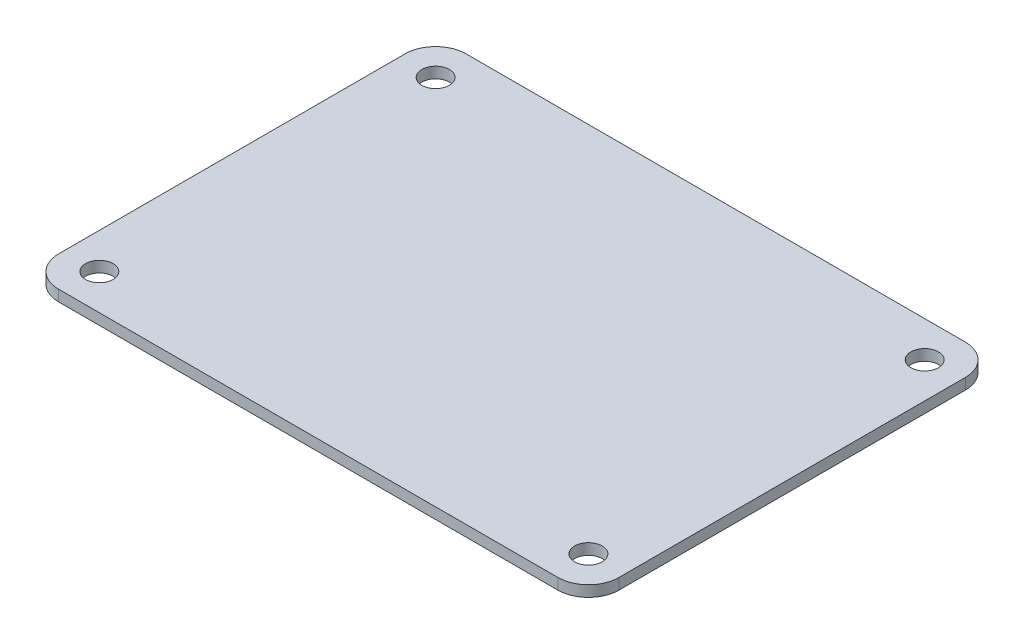
ISO-10303-21;
HEADER;
FILE_DESCRIPTION(('STEP AP214'),'2;1');
FILE_NAME('part.step','',(''),(''),'','','');
FILE_SCHEMA(('AUTOMOTIVE_DESIGN { 1 0 10303 214 1 1 1 1 }'));
ENDSEC;
DATA;
#1=APPLICATION_CONTEXT('core data for automotive mechanical design processes');
#2=APPLICATION_PROTOCOL_DEFINITION('international standard','automotive_design',2000,#1);
#3=PRODUCT_CONTEXT('',#1,'mechanical');
#4=PRODUCT('Part','Part','',(#3));
#5=PRODUCT_RELATED_PRODUCT_CATEGORY('part','',(#4));
#6=PRODUCT_DEFINITION_FORMATION('','',#4);
#7=PRODUCT_DEFINITION_CONTEXT('part definition',#1,'design');
#8=PRODUCT_DEFINITION('design','',#6,#7);
#9=PRODUCT_DEFINITION_SHAPE('','',#8);
#10=(LENGTH_UNIT() NAMED_UNIT(*) SI_UNIT(.MILLI.,.METRE.));
#11=(NAMED_UNIT(*) PLANE_ANGLE_UNIT() SI_UNIT($,.RADIAN.));
#12=(NAMED_UNIT(*) SI_UNIT($,.STERADIAN.) SOLID_ANGLE_UNIT());
#13=UNCERTAINTY_MEASURE_WITH_UNIT(LENGTH_MEASURE(1.E-05),#10,'distance_accuracy_value','');
#14=(GEOMETRIC_REPRESENTATION_CONTEXT(3) GLOBAL_UNCERTAINTY_ASSIGNED_CONTEXT((#13)) GLOBAL_UNIT_ASSIGNED_CONTEXT((#10,
#11,#12)) REPRESENTATION_CONTEXT('',''));
#15=CARTESIAN_POINT('',(0.,0.,0.));
#16=DIRECTION('',(0.,0.,1.));
#17=DIRECTION('',(1.,0.,0.));
#18=AXIS2_PLACEMENT_3D('',#15,#16,#17);
#19=CARTESIAN_POINT('',(-24.5,1.08,17.));
#20=DIRECTION('',(0.,-1.,0.));
#21=DIRECTION('',(0.,0.,-1.));
#22=AXIS2_PLACEMENT_3D('',#19,#20,#21);
#23=PLANE('',#22);
#24=CARTESIAN_POINT('',(-24.5,1.08,17.));
#25=DIRECTION('',(0.,1.,0.));
#26=DIRECTION('',(0.,0.,-1.));
#27=AXIS2_PLACEMENT_3D('',#24,#25,#26);
#28=CIRCLE('',#27,3.);
#29=CARTESIAN_POINT('',(-27.5,1.08,17.));
#30=VERTEX_POINT('',#29);
#31=CARTESIAN_POINT('',(-24.5,1.08,20.));
#32=VERTEX_POINT('',#31);
#33=EDGE_CURVE('E192',#30,#32,#28,.T.);
#34=ORIENTED_EDGE('',*,*,#33,.T.);
#35=DIRECTION('',(1.,0.,0.));
#36=VECTOR('',#35,1.);
#37=CARTESIAN_POINT('',(-24.5,1.08,20.));
#38=LINE('',#37,#36);
#39=CARTESIAN_POINT('',(24.5,1.08,20.));
#40=VERTEX_POINT('',#39);
#41=EDGE_CURVE('E123',#32,#40,#38,.T.);
#42=ORIENTED_EDGE('',*,*,#41,.T.);
#43=CARTESIAN_POINT('',(24.5,1.08,17.));
#44=DIRECTION('',(0.,1.,0.));
#45=DIRECTION('',(0.,0.,1.));
#46=AXIS2_PLACEMENT_3D('',#43,#44,#45);
#47=CIRCLE('',#46,3.);
#48=CARTESIAN_POINT('',(27.5,1.08,17.));
#49=VERTEX_POINT('',#48);
#50=EDGE_CURVE('E211',#40,#49,#47,.T.);
#51=ORIENTED_EDGE('',*,*,#50,.T.);
#52=DIRECTION('',(0.,0.,-1.));
#53=VECTOR('',#52,1.);
#54=CARTESIAN_POINT('',(27.5,1.08,17.));
#55=LINE('',#54,#53);
#56=CARTESIAN_POINT('',(27.5,1.08,-17.));
#57=VERTEX_POINT('',#56);
#58=EDGE_CURVE('E230',#49,#57,#55,.T.);
#59=ORIENTED_EDGE('',*,*,#58,.T.);
#60=CARTESIAN_POINT('',(24.5,1.08,-17.));
#61=DIRECTION('',(0.,1.,0.));
#62=DIRECTION('',(0.,0.,-1.));
#63=AXIS2_PLACEMENT_3D('',#60,#61,#62);
#64=CIRCLE('',#63,3.);
#65=CARTESIAN_POINT('',(24.5,1.08,-20.));
#66=VERTEX_POINT('',#65);
#67=EDGE_CURVE('E144',#57,#66,#64,.T.);
#68=ORIENTED_EDGE('',*,*,#67,.T.);
#69=DIRECTION('',(-1.,0.,0.));
#70=VECTOR('',#69,1.);
#71=CARTESIAN_POINT('',(-24.5,1.08,-20.));
#72=LINE('',#71,#70);
#73=CARTESIAN_POINT('',(-24.5,1.08,-20.));
#74=VERTEX_POINT('',#73);
#75=EDGE_CURVE('E137',#66,#74,#72,.T.);
#76=ORIENTED_EDGE('',*,*,#75,.T.);
#77=CARTESIAN_POINT('',(-24.5,1.08,-17.));
#78=DIRECTION('',(0.,1.,0.));
#79=DIRECTION('',(0.,0.,-1.));
#80=AXIS2_PLACEMENT_3D('',#77,#78,#79);
#81=CIRCLE('',#80,3.);
#82=CARTESIAN_POINT('',(-27.5,1.08,-17.));
#83=VERTEX_POINT('',#82);
#84=EDGE_CURVE('E142',#74,#83,#81,.T.);
#85=ORIENTED_EDGE('',*,*,#84,.T.);
#86=DIRECTION('',(0.,0.,1.));
#87=VECTOR('',#86,1.);
#88=CARTESIAN_POINT('',(-27.5,1.08,17.));
#89=LINE('',#88,#87);
#90=EDGE_CURVE('E62',#83,#30,#89,.T.);
#91=ORIENTED_EDGE('',*,*,#90,.T.);
#92=EDGE_LOOP('',(#34,#42,#51,#59,#68,#76,#85,#91));
#93=FACE_BOUND('',#92,.T.);
#94=CARTESIAN_POINT('',(-24.,1.08,-16.5));
#95=DIRECTION('',(0.,1.,0.));
#96=DIRECTION('',(0.,0.,1.));
#97=AXIS2_PLACEMENT_3D('',#94,#95,#96);
#98=CIRCLE('',#97,1.35);
#99=CARTESIAN_POINT('',(-24.,1.08,-15.15));
#100=VERTEX_POINT('',#99);
#101=EDGE_CURVE('E171',#100,#100,#98,.T.);
#102=ORIENTED_EDGE('',*,*,#101,.F.);
#103=EDGE_LOOP('',(#102));
#104=FACE_BOUND('',#103,.T.);
#105=CARTESIAN_POINT('',(-24.,1.08,16.5));
#106=DIRECTION('',(0.,1.,0.));
#107=DIRECTION('',(0.,0.,1.));
#108=AXIS2_PLACEMENT_3D('',#105,#106,#107);
#109=CIRCLE('',#108,1.35);
#110=CARTESIAN_POINT('',(-24.,1.08,17.85));
#111=VERTEX_POINT('',#110);
#112=EDGE_CURVE('E245',#111,#111,#109,.T.);
#113=ORIENTED_EDGE('',*,*,#112,.F.);
#114=EDGE_LOOP('',(#113));
#115=FACE_BOUND('',#114,.T.);
#116=CARTESIAN_POINT('',(24.,1.08,-16.5));
#117=DIRECTION('',(0.,1.,0.));
#118=DIRECTION('',(0.,0.,1.));
#119=AXIS2_PLACEMENT_3D('',#116,#117,#118);
#120=CIRCLE('',#119,1.35);
#121=CARTESIAN_POINT('',(24.,1.08,-15.15));
#122=VERTEX_POINT('',#121);
#123=EDGE_CURVE('E248',#122,#122,#120,.T.);
#124=ORIENTED_EDGE('',*,*,#123,.F.);
#125=EDGE_LOOP('',(#124));
#126=FACE_BOUND('',#125,.T.);
#127=CARTESIAN_POINT('',(24.,1.08,16.5));
#128=DIRECTION('',(0.,1.,0.));
#129=DIRECTION('',(0.,0.,1.));
#130=AXIS2_PLACEMENT_3D('',#127,#128,#129);
#131=CIRCLE('',#130,1.35000000000001);
#132=CARTESIAN_POINT('',(24.,1.08,17.85));
#133=VERTEX_POINT('',#132);
#134=EDGE_CURVE('E256',#133,#133,#131,.T.);
#135=ORIENTED_EDGE('',*,*,#134,.F.);
#136=EDGE_LOOP('',(#135));
#137=FACE_BOUND('',#136,.T.);
#138=ADVANCED_FACE('F43',(#93,#104,#115,#126,#137),#23,.F.);
#139=CARTESIAN_POINT('',(-24.5,0.,17.));
#140=DIRECTION('',(0.,-1.,0.));
#141=DIRECTION('',(0.,0.,-1.));
#142=AXIS2_PLACEMENT_3D('',#139,#140,#141);
#143=PLANE('',#142);
#144=CARTESIAN_POINT('',(24.,0.,-16.5));
#145=DIRECTION('',(0.,1.,0.));
#146=DIRECTION('',(0.,0.,1.));
#147=AXIS2_PLACEMENT_3D('',#144,#145,#146);
#148=CIRCLE('',#147,1.35);
#149=CARTESIAN_POINT('',(24.,0.,-15.15));
#150=VERTEX_POINT('',#149);
#151=EDGE_CURVE('E254',#150,#150,#148,.T.);
#152=ORIENTED_EDGE('',*,*,#151,.T.);
#153=EDGE_LOOP('',(#152));
#154=FACE_BOUND('',#153,.T.);
#155=CARTESIAN_POINT('',(-24.,0.,-16.5));
#156=DIRECTION('',(0.,1.,0.));
#157=DIRECTION('',(0.,0.,1.));
#158=AXIS2_PLACEMENT_3D('',#155,#156,#157);
#159=CIRCLE('',#158,1.35);
#160=CARTESIAN_POINT('',(-24.,0.,-15.15));
#161=VERTEX_POINT('',#160);
#162=EDGE_CURVE('E239',#161,#161,#159,.T.);
#163=ORIENTED_EDGE('',*,*,#162,.T.);
#164=EDGE_LOOP('',(#163));
#165=FACE_BOUND('',#164,.T.);
#166=CARTESIAN_POINT('',(-24.5,0.,17.));
#167=DIRECTION('',(0.,1.,0.));
#168=DIRECTION('',(0.,0.,-1.));
#169=AXIS2_PLACEMENT_3D('',#166,#167,#168);
#170=CIRCLE('',#169,3.);
#171=CARTESIAN_POINT('',(-27.5,0.,17.));
#172=VERTEX_POINT('',#171);
#173=CARTESIAN_POINT('',(-24.5,0.,20.));
#174=VERTEX_POINT('',#173);
#175=EDGE_CURVE('E166',#172,#174,#170,.T.);
#176=ORIENTED_EDGE('',*,*,#175,.F.);
#177=DIRECTION('',(0.,0.,1.));
#178=VECTOR('',#177,1.);
#179=CARTESIAN_POINT('',(-27.5,0.,17.));
#180=LINE('',#179,#178);
#181=CARTESIAN_POINT('',(-27.5,0.,-17.));
#182=VERTEX_POINT('',#181);
#183=EDGE_CURVE('E112',#182,#172,#180,.T.);
#184=ORIENTED_EDGE('',*,*,#183,.F.);
#185=CARTESIAN_POINT('',(-24.5,0.,-17.));
#186=DIRECTION('',(0.,1.,0.));
#187=DIRECTION('',(0.,0.,-1.));
#188=AXIS2_PLACEMENT_3D('',#185,#186,#187);
#189=CIRCLE('',#188,3.);
#190=CARTESIAN_POINT('',(-24.5,0.,-20.));
#191=VERTEX_POINT('',#190);
#192=EDGE_CURVE('E104',#191,#182,#189,.T.);
#193=ORIENTED_EDGE('',*,*,#192,.F.);
#194=DIRECTION('',(-1.,0.,0.));
#195=VECTOR('',#194,1.);
#196=CARTESIAN_POINT('',(-24.5,0.,-20.));
#197=LINE('',#196,#195);
#198=CARTESIAN_POINT('',(24.5,0.,-20.));
#199=VERTEX_POINT('',#198);
#200=EDGE_CURVE('E154',#199,#191,#197,.T.);
#201=ORIENTED_EDGE('',*,*,#200,.F.);
#202=CARTESIAN_POINT('',(24.5,0.,-17.));
#203=DIRECTION('',(0.,1.,0.));
#204=DIRECTION('',(0.,0.,-1.));
#205=AXIS2_PLACEMENT_3D('',#202,#203,#204);
#206=CIRCLE('',#205,3.);
#207=CARTESIAN_POINT('',(27.5,0.,-17.));
#208=VERTEX_POINT('',#207);
#209=EDGE_CURVE('E185',#208,#199,#206,.T.);
#210=ORIENTED_EDGE('',*,*,#209,.F.);
#211=DIRECTION('',(0.,0.,-1.));
#212=VECTOR('',#211,1.);
#213=CARTESIAN_POINT('',(27.5,0.,17.));
#214=LINE('',#213,#212);
#215=CARTESIAN_POINT('',(27.5,0.,17.));
#216=VERTEX_POINT('',#215);
#217=EDGE_CURVE('E177',#216,#208,#214,.T.);
#218=ORIENTED_EDGE('',*,*,#217,.F.);
#219=CARTESIAN_POINT('',(24.5,0.,17.));
#220=DIRECTION('',(0.,1.,0.));
#221=DIRECTION('',(0.,0.,1.));
#222=AXIS2_PLACEMENT_3D('',#219,#220,#221);
#223=CIRCLE('',#222,3.);
#224=CARTESIAN_POINT('',(24.5,0.,20.));
#225=VERTEX_POINT('',#224);
#226=EDGE_CURVE('E176',#225,#216,#223,.T.);
#227=ORIENTED_EDGE('',*,*,#226,.F.);
#228=DIRECTION('',(1.,0.,0.));
#229=VECTOR('',#228,1.);
#230=CARTESIAN_POINT('',(-24.5,0.,20.));
#231=LINE('',#230,#229);
#232=EDGE_CURVE('E175',#174,#225,#231,.T.);
#233=ORIENTED_EDGE('',*,*,#232,.F.);
#234=EDGE_LOOP('',(#176,#184,#193,#201,#210,#218,#227,#233));
#235=FACE_BOUND('',#234,.T.);
#236=CARTESIAN_POINT('',(-24.,0.,16.5));
#237=DIRECTION('',(0.,1.,0.));
#238=DIRECTION('',(0.,0.,1.));
#239=AXIS2_PLACEMENT_3D('',#236,#237,#238);
#240=CIRCLE('',#239,1.35);
#241=CARTESIAN_POINT('',(-24.,0.,17.85));
#242=VERTEX_POINT('',#241);
#243=EDGE_CURVE('E247',#242,#242,#240,.T.);
#244=ORIENTED_EDGE('',*,*,#243,.T.);
#245=EDGE_LOOP('',(#244));
#246=FACE_BOUND('',#245,.T.);
#247=CARTESIAN_POINT('',(24.,0.,16.5));
#248=DIRECTION('',(0.,1.,0.));
#249=DIRECTION('',(0.,0.,1.));
#250=AXIS2_PLACEMENT_3D('',#247,#248,#249);
#251=CIRCLE('',#250,1.35000000000001);
#252=CARTESIAN_POINT('',(24.,0.,17.85));
#253=VERTEX_POINT('',#252);
#254=EDGE_CURVE('E265',#253,#253,#251,.T.);
#255=ORIENTED_EDGE('',*,*,#254,.T.);
#256=EDGE_LOOP('',(#255));
#257=FACE_BOUND('',#256,.T.);
#258=ADVANCED_FACE('F220',(#154,#165,#235,#246,#257),#143,.T.);
#259=CARTESIAN_POINT('',(-24.5,1.08,17.));
#260=DIRECTION('',(0.,-1.,0.));
#261=DIRECTION('',(0.,0.,-1.));
#262=AXIS2_PLACEMENT_3D('',#259,#260,#261);
#263=CYLINDRICAL_SURFACE('',#262,3.);
#264=ORIENTED_EDGE('',*,*,#175,.T.);
#265=DIRECTION('',(0.,-1.,0.));
#266=VECTOR('',#265,1.);
#267=CARTESIAN_POINT('',(-24.5,1.08,20.));
#268=LINE('',#267,#266);
#269=EDGE_CURVE('E11',#32,#174,#268,.T.);
#270=ORIENTED_EDGE('',*,*,#269,.F.);
#271=ORIENTED_EDGE('',*,*,#33,.F.);
#272=DIRECTION('',(0.,-1.,0.));
#273=VECTOR('',#272,1.);
#274=CARTESIAN_POINT('',(-27.5,1.08,17.));
#275=LINE('',#274,#273);
#276=EDGE_CURVE('E164',#30,#172,#275,.T.);
#277=ORIENTED_EDGE('',*,*,#276,.T.);
#278=EDGE_LOOP('',(#264,#270,#271,#277));
#279=FACE_BOUND('',#278,.T.);
#280=ADVANCED_FACE('F44',(#279),#263,.T.);
#281=CARTESIAN_POINT('',(-24.5,1.08,20.));
#282=DIRECTION('',(0.,0.,-1.));
#283=DIRECTION('',(-1.,0.,0.));
#284=AXIS2_PLACEMENT_3D('',#281,#282,#283);
#285=PLANE('',#284);
#286=ORIENTED_EDGE('',*,*,#232,.T.);
#287=DIRECTION('',(0.,-1.,0.));
#288=VECTOR('',#287,1.);
#289=CARTESIAN_POINT('',(24.5,1.08,20.));
#290=LINE('',#289,#288);
#291=EDGE_CURVE('E52',#40,#225,#290,.T.);
#292=ORIENTED_EDGE('',*,*,#291,.F.);
#293=ORIENTED_EDGE('',*,*,#41,.F.);
#294=ORIENTED_EDGE('',*,*,#269,.T.);
#295=EDGE_LOOP('',(#286,#292,#293,#294));
#296=FACE_BOUND('',#295,.T.);
#297=ADVANCED_FACE('F300',(#296),#285,.F.);
#298=CARTESIAN_POINT('',(24.5,1.08,17.));
#299=DIRECTION('',(0.,-1.,0.));
#300=DIRECTION('',(0.,0.,-1.));
#301=AXIS2_PLACEMENT_3D('',#298,#299,#300);
#302=CYLINDRICAL_SURFACE('',#301,3.);
#303=ORIENTED_EDGE('',*,*,#226,.T.);
#304=DIRECTION('',(0.,-1.,0.));
#305=VECTOR('',#304,1.);
#306=CARTESIAN_POINT('',(27.5,1.08,17.));
#307=LINE('',#306,#305);
#308=EDGE_CURVE('E205',#49,#216,#307,.T.);
#309=ORIENTED_EDGE('',*,*,#308,.F.);
#310=ORIENTED_EDGE('',*,*,#50,.F.);
#311=ORIENTED_EDGE('',*,*,#291,.T.);
#312=EDGE_LOOP('',(#303,#309,#310,#311));
#313=FACE_BOUND('',#312,.T.);
#314=ADVANCED_FACE('F213',(#313),#302,.T.);
#315=CARTESIAN_POINT('',(27.5,1.08,17.));
#316=DIRECTION('',(-1.,0.,0.));
#317=DIRECTION('',(0.,0.,1.));
#318=AXIS2_PLACEMENT_3D('',#315,#316,#317);
#319=PLANE('',#318);
#320=ORIENTED_EDGE('',*,*,#217,.T.);
#321=DIRECTION('',(0.,-1.,0.));
#322=VECTOR('',#321,1.);
#323=CARTESIAN_POINT('',(27.5,1.08,-17.));
#324=LINE('',#323,#322);
#325=EDGE_CURVE('E196',#57,#208,#324,.T.);
#326=ORIENTED_EDGE('',*,*,#325,.F.);
#327=ORIENTED_EDGE('',*,*,#58,.F.);
#328=ORIENTED_EDGE('',*,*,#308,.T.);
#329=EDGE_LOOP('',(#320,#326,#327,#328));
#330=FACE_BOUND('',#329,.T.);
#331=ADVANCED_FACE('F225',(#330),#319,.F.);
#332=CARTESIAN_POINT('',(24.5,1.08,-17.));
#333=DIRECTION('',(0.,-1.,0.));
#334=DIRECTION('',(0.,0.,-1.));
#335=AXIS2_PLACEMENT_3D('',#332,#333,#334);
#336=CYLINDRICAL_SURFACE('',#335,3.);
#337=ORIENTED_EDGE('',*,*,#209,.T.);
#338=DIRECTION('',(0.,-1.,0.));
#339=VECTOR('',#338,1.);
#340=CARTESIAN_POINT('',(24.5,1.08,-20.));
#341=LINE('',#340,#339);
#342=EDGE_CURVE('E157',#66,#199,#341,.T.);
#343=ORIENTED_EDGE('',*,*,#342,.F.);
#344=ORIENTED_EDGE('',*,*,#67,.F.);
#345=ORIENTED_EDGE('',*,*,#325,.T.);
#346=EDGE_LOOP('',(#337,#343,#344,#345));
#347=FACE_BOUND('',#346,.T.);
#348=ADVANCED_FACE('F224',(#347),#336,.T.);
#349=CARTESIAN_POINT('',(-24.5,1.08,-20.));
#350=DIRECTION('',(0.,0.,1.));
#351=DIRECTION('',(1.,0.,0.));
#352=AXIS2_PLACEMENT_3D('',#349,#350,#351);
#353=PLANE('',#352);
#354=ORIENTED_EDGE('',*,*,#200,.T.);
#355=DIRECTION('',(0.,-1.,0.));
#356=VECTOR('',#355,1.);
#357=CARTESIAN_POINT('',(-24.5,1.08,-20.));
#358=LINE('',#357,#356);
#359=EDGE_CURVE('E153',#74,#191,#358,.T.);
#360=ORIENTED_EDGE('',*,*,#359,.F.);
#361=ORIENTED_EDGE('',*,*,#75,.F.);
#362=ORIENTED_EDGE('',*,*,#342,.T.);
#363=EDGE_LOOP('',(#354,#360,#361,#362));
#364=FACE_BOUND('',#363,.T.);
#365=ADVANCED_FACE('F155',(#364),#353,.F.);
#366=CARTESIAN_POINT('',(-24.5,1.08,-17.));
#367=DIRECTION('',(0.,-1.,0.));
#368=DIRECTION('',(0.,0.,-1.));
#369=AXIS2_PLACEMENT_3D('',#366,#367,#368);
#370=CYLINDRICAL_SURFACE('',#369,3.);
#371=ORIENTED_EDGE('',*,*,#192,.T.);
#372=DIRECTION('',(0.,-1.,0.));
#373=VECTOR('',#372,1.);
#374=CARTESIAN_POINT('',(-27.5,1.08,-17.));
#375=LINE('',#374,#373);
#376=EDGE_CURVE('E160',#83,#182,#375,.T.);
#377=ORIENTED_EDGE('',*,*,#376,.F.);
#378=ORIENTED_EDGE('',*,*,#84,.F.);
#379=ORIENTED_EDGE('',*,*,#359,.T.);
#380=EDGE_LOOP('',(#371,#377,#378,#379));
#381=FACE_BOUND('',#380,.T.);
#382=ADVANCED_FACE('F159',(#381),#370,.T.);
#383=CARTESIAN_POINT('',(-27.5,1.08,17.));
#384=DIRECTION('',(1.,0.,0.));
#385=DIRECTION('',(0.,0.,-1.));
#386=AXIS2_PLACEMENT_3D('',#383,#384,#385);
#387=PLANE('',#386);
#388=ORIENTED_EDGE('',*,*,#183,.T.);
#389=ORIENTED_EDGE('',*,*,#276,.F.);
#390=ORIENTED_EDGE('',*,*,#90,.F.);
#391=ORIENTED_EDGE('',*,*,#376,.T.);
#392=EDGE_LOOP('',(#388,#389,#390,#391));
#393=FACE_BOUND('',#392,.T.);
#394=ADVANCED_FACE('F283',(#393),#387,.F.);
#395=CARTESIAN_POINT('',(-24.,1.08,-16.5));
#396=DIRECTION('',(0.,-1.,0.));
#397=DIRECTION('',(0.,0.,-1.));
#398=AXIS2_PLACEMENT_3D('',#395,#396,#397);
#399=CYLINDRICAL_SURFACE('',#398,1.35);
#400=ORIENTED_EDGE('',*,*,#101,.T.);
#401=EDGE_LOOP('',(#400));
#402=FACE_BOUND('',#401,.T.);
#403=ORIENTED_EDGE('',*,*,#162,.F.);
#404=EDGE_LOOP('',(#403));
#405=FACE_BOUND('',#404,.T.);
#406=ADVANCED_FACE('F285',(#402,#405),#399,.F.);
#407=CARTESIAN_POINT('',(-24.,1.08,16.5));
#408=DIRECTION('',(0.,-1.,0.));
#409=DIRECTION('',(0.,0.,-1.));
#410=AXIS2_PLACEMENT_3D('',#407,#408,#409);
#411=CYLINDRICAL_SURFACE('',#410,1.35);
#412=ORIENTED_EDGE('',*,*,#112,.T.);
#413=EDGE_LOOP('',(#412));
#414=FACE_BOUND('',#413,.T.);
#415=ORIENTED_EDGE('',*,*,#243,.F.);
#416=EDGE_LOOP('',(#415));
#417=FACE_BOUND('',#416,.T.);
#418=ADVANCED_FACE('F374',(#414,#417),#411,.F.);
#419=CARTESIAN_POINT('',(24.,1.08,-16.5));
#420=DIRECTION('',(0.,-1.,0.));
#421=DIRECTION('',(0.,0.,-1.));
#422=AXIS2_PLACEMENT_3D('',#419,#420,#421);
#423=CYLINDRICAL_SURFACE('',#422,1.35);
#424=ORIENTED_EDGE('',*,*,#123,.T.);
#425=EDGE_LOOP('',(#424));
#426=FACE_BOUND('',#425,.T.);
#427=ORIENTED_EDGE('',*,*,#151,.F.);
#428=EDGE_LOOP('',(#427));
#429=FACE_BOUND('',#428,.T.);
#430=ADVANCED_FACE('F385',(#426,#429),#423,.F.);
#431=CARTESIAN_POINT('',(24.,1.08,16.5));
#432=DIRECTION('',(0.,-1.,0.));
#433=DIRECTION('',(0.,0.,-1.));
#434=AXIS2_PLACEMENT_3D('',#431,#432,#433);
#435=CYLINDRICAL_SURFACE('',#434,1.35000000000001);
#436=ORIENTED_EDGE('',*,*,#134,.T.);
#437=EDGE_LOOP('',(#436));
#438=FACE_BOUND('',#437,.T.);
#439=ORIENTED_EDGE('',*,*,#254,.F.);
#440=EDGE_LOOP('',(#439));
#441=FACE_BOUND('',#440,.T.);
#442=ADVANCED_FACE('F269',(#438,#441),#435,.F.);
#443=CLOSED_SHELL('',(#138,#258,#280,#297,#314,#331,#348,#365,#382,#394,#406,#418,#430,#442));
#444=MANIFOLD_SOLID_BREP('B2',#443);
#445=ADVANCED_BREP_SHAPE_REPRESENTATION('',(#18,#444),#14);
#446=SHAPE_DEFINITION_REPRESENTATION(#9,#445);
ENDSEC;
END-ISO-10303-21;
